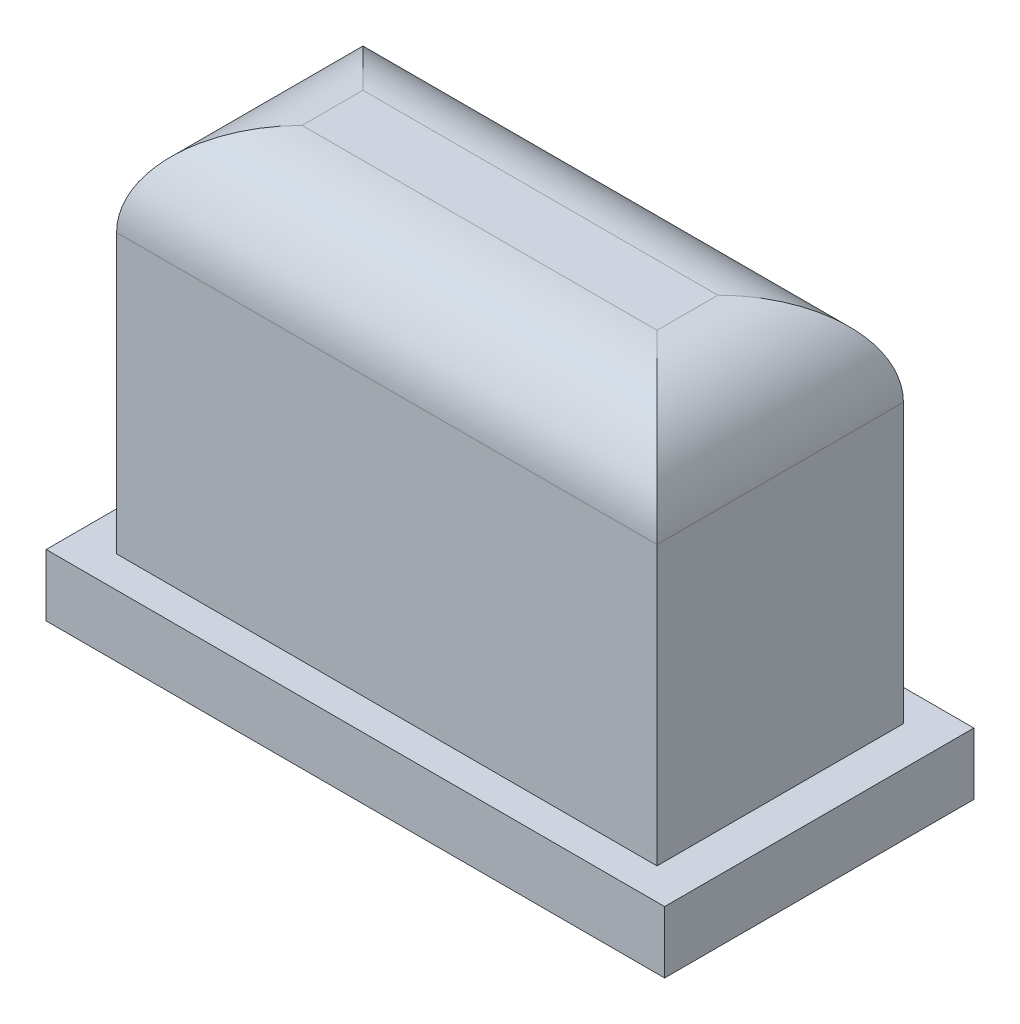
ISO-10303-21;
HEADER;
FILE_DESCRIPTION(('STEP AP214'),'2;1');
FILE_NAME('part.step','',(''),(''),'','','');
FILE_SCHEMA(('AUTOMOTIVE_DESIGN { 1 0 10303 214 1 1 1 1 }'));
ENDSEC;
DATA;
#1=APPLICATION_CONTEXT('core data for automotive mechanical design processes');
#2=APPLICATION_PROTOCOL_DEFINITION('international standard','automotive_design',2000,#1);
#3=PRODUCT_CONTEXT('',#1,'mechanical');
#4=PRODUCT('Part','Part','',(#3));
#5=PRODUCT_RELATED_PRODUCT_CATEGORY('part','',(#4));
#6=PRODUCT_DEFINITION_FORMATION('','',#4);
#7=PRODUCT_DEFINITION_CONTEXT('part definition',#1,'design');
#8=PRODUCT_DEFINITION('design','',#6,#7);
#9=PRODUCT_DEFINITION_SHAPE('','',#8);
#10=(LENGTH_UNIT() NAMED_UNIT(*) SI_UNIT(.MILLI.,.METRE.));
#11=(NAMED_UNIT(*) PLANE_ANGLE_UNIT() SI_UNIT($,.RADIAN.));
#12=(NAMED_UNIT(*) SI_UNIT($,.STERADIAN.) SOLID_ANGLE_UNIT());
#13=UNCERTAINTY_MEASURE_WITH_UNIT(LENGTH_MEASURE(1.E-05),#10,'distance_accuracy_value','');
#14=(GEOMETRIC_REPRESENTATION_CONTEXT(3) GLOBAL_UNCERTAINTY_ASSIGNED_CONTEXT((#13)) GLOBAL_UNIT_ASSIGNED_CONTEXT((#10,
#11,#12)) REPRESENTATION_CONTEXT('',''));
#15=CARTESIAN_POINT('',(0.,0.,0.));
#16=DIRECTION('',(0.,0.,1.));
#17=DIRECTION('',(1.,0.,0.));
#18=AXIS2_PLACEMENT_3D('',#15,#16,#17);
#19=CARTESIAN_POINT('',(0.,10.,0.));
#20=DIRECTION('',(0.,-1.,0.));
#21=DIRECTION('',(0.,0.,-1.));
#22=AXIS2_PLACEMENT_3D('',#19,#20,#21);
#23=PLANE('',#22);
#24=DIRECTION('',(0.,0.,-1.));
#25=VECTOR('',#24,1.);
#26=CARTESIAN_POINT('',(50.,10.,25.));
#27=LINE('',#26,#25);
#28=CARTESIAN_POINT('',(50.,10.,25.));
#29=VERTEX_POINT('',#28);
#30=CARTESIAN_POINT('',(50.,10.,-25.));
#31=VERTEX_POINT('',#30);
#32=EDGE_CURVE('E146',#29,#31,#27,.T.);
#33=ORIENTED_EDGE('',*,*,#32,.T.);
#34=DIRECTION('',(-1.,0.,0.));
#35=VECTOR('',#34,1.);
#36=CARTESIAN_POINT('',(-50.,10.,-25.));
#37=LINE('',#36,#35);
#38=CARTESIAN_POINT('',(-50.,10.,-25.));
#39=VERTEX_POINT('',#38);
#40=EDGE_CURVE('E149',#31,#39,#37,.T.);
#41=ORIENTED_EDGE('',*,*,#40,.T.);
#42=DIRECTION('',(0.,0.,1.));
#43=VECTOR('',#42,1.);
#44=CARTESIAN_POINT('',(-50.,10.,25.));
#45=LINE('',#44,#43);
#46=CARTESIAN_POINT('',(-50.,10.,25.));
#47=VERTEX_POINT('',#46);
#48=EDGE_CURVE('E152',#39,#47,#45,.T.);
#49=ORIENTED_EDGE('',*,*,#48,.T.);
#50=DIRECTION('',(1.,0.,0.));
#51=VECTOR('',#50,1.);
#52=CARTESIAN_POINT('',(-50.,10.,25.));
#53=LINE('',#52,#51);
#54=EDGE_CURVE('E154',#47,#29,#53,.T.);
#55=ORIENTED_EDGE('',*,*,#54,.T.);
#56=EDGE_LOOP('',(#33,#41,#49,#55));
#57=FACE_BOUND('',#56,.T.);
#58=DIRECTION('',(0.,0.,1.));
#59=VECTOR('',#58,1.);
#60=CARTESIAN_POINT('',(-43.6901872313672,10.,19.9187908015427));
#61=LINE('',#60,#59);
#62=CARTESIAN_POINT('',(-43.6901872313672,10.,-19.9187908015427));
#63=VERTEX_POINT('',#62);
#64=CARTESIAN_POINT('',(-43.6901872313672,10.,19.9187908015427));
#65=VERTEX_POINT('',#64);
#66=EDGE_CURVE('E119',#63,#65,#61,.T.);
#67=ORIENTED_EDGE('',*,*,#66,.F.);
#68=DIRECTION('',(-1.,0.,0.));
#69=VECTOR('',#68,1.);
#70=CARTESIAN_POINT('',(43.6901872313672,10.,-19.9187908015427));
#71=LINE('',#70,#69);
#72=CARTESIAN_POINT('',(43.6901872313672,10.,-19.9187908015427));
#73=VERTEX_POINT('',#72);
#74=EDGE_CURVE('E124',#73,#63,#71,.T.);
#75=ORIENTED_EDGE('',*,*,#74,.F.);
#76=DIRECTION('',(0.,0.,-1.));
#77=VECTOR('',#76,1.);
#78=CARTESIAN_POINT('',(43.6901872313672,10.,19.9187908015427));
#79=LINE('',#78,#77);
#80=CARTESIAN_POINT('',(43.6901872313672,10.,19.9187908015427));
#81=VERTEX_POINT('',#80);
#82=EDGE_CURVE('E135',#81,#73,#79,.T.);
#83=ORIENTED_EDGE('',*,*,#82,.F.);
#84=DIRECTION('',(1.,0.,0.));
#85=VECTOR('',#84,1.);
#86=CARTESIAN_POINT('',(43.6901872313672,10.,19.9187908015427));
#87=LINE('',#86,#85);
#88=EDGE_CURVE('E132',#65,#81,#87,.T.);
#89=ORIENTED_EDGE('',*,*,#88,.F.);
#90=EDGE_LOOP('',(#67,#75,#83,#89));
#91=FACE_BOUND('',#90,.T.);
#92=ADVANCED_FACE('F37',(#57,#91),#23,.F.);
#93=CARTESIAN_POINT('',(50.,10.,25.));
#94=DIRECTION('',(-1.,0.,0.));
#95=DIRECTION('',(0.,0.,1.));
#96=AXIS2_PLACEMENT_3D('',#93,#94,#95);
#97=PLANE('',#96);
#98=DIRECTION('',(0.,0.,-1.));
#99=VECTOR('',#98,1.);
#100=CARTESIAN_POINT('',(50.,0.,25.));
#101=LINE('',#100,#99);
#102=CARTESIAN_POINT('',(50.,0.,25.));
#103=VERTEX_POINT('',#102);
#104=CARTESIAN_POINT('',(50.,0.,-25.));
#105=VERTEX_POINT('',#104);
#106=EDGE_CURVE('E145',#103,#105,#101,.T.);
#107=ORIENTED_EDGE('',*,*,#106,.T.);
#108=DIRECTION('',(0.,-1.,0.));
#109=VECTOR('',#108,1.);
#110=CARTESIAN_POINT('',(50.,10.,-25.));
#111=LINE('',#110,#109);
#112=EDGE_CURVE('E172',#31,#105,#111,.T.);
#113=ORIENTED_EDGE('',*,*,#112,.F.);
#114=ORIENTED_EDGE('',*,*,#32,.F.);
#115=DIRECTION('',(0.,-1.,0.));
#116=VECTOR('',#115,1.);
#117=CARTESIAN_POINT('',(50.,10.,25.));
#118=LINE('',#117,#116);
#119=EDGE_CURVE('E156',#29,#103,#118,.T.);
#120=ORIENTED_EDGE('',*,*,#119,.T.);
#121=EDGE_LOOP('',(#107,#113,#114,#120));
#122=FACE_BOUND('',#121,.T.);
#123=ADVANCED_FACE('F224',(#122),#97,.F.);
#124=CARTESIAN_POINT('',(-50.,10.,-25.));
#125=DIRECTION('',(0.,0.,1.));
#126=DIRECTION('',(1.,0.,0.));
#127=AXIS2_PLACEMENT_3D('',#124,#125,#126);
#128=PLANE('',#127);
#129=DIRECTION('',(-1.,0.,0.));
#130=VECTOR('',#129,1.);
#131=CARTESIAN_POINT('',(-50.,0.,-25.));
#132=LINE('',#131,#130);
#133=CARTESIAN_POINT('',(-50.,0.,-25.));
#134=VERTEX_POINT('',#133);
#135=EDGE_CURVE('E159',#105,#134,#132,.T.);
#136=ORIENTED_EDGE('',*,*,#135,.T.);
#137=DIRECTION('',(0.,-1.,0.));
#138=VECTOR('',#137,1.);
#139=CARTESIAN_POINT('',(-50.,10.,-25.));
#140=LINE('',#139,#138);
#141=EDGE_CURVE('E169',#39,#134,#140,.T.);
#142=ORIENTED_EDGE('',*,*,#141,.F.);
#143=ORIENTED_EDGE('',*,*,#40,.F.);
#144=ORIENTED_EDGE('',*,*,#112,.T.);
#145=EDGE_LOOP('',(#136,#142,#143,#144));
#146=FACE_BOUND('',#145,.T.);
#147=ADVANCED_FACE('F230',(#146),#128,.F.);
#148=CARTESIAN_POINT('',(-50.,10.,25.));
#149=DIRECTION('',(1.,0.,0.));
#150=DIRECTION('',(0.,0.,-1.));
#151=AXIS2_PLACEMENT_3D('',#148,#149,#150);
#152=PLANE('',#151);
#153=DIRECTION('',(0.,0.,1.));
#154=VECTOR('',#153,1.);
#155=CARTESIAN_POINT('',(-50.,0.,25.));
#156=LINE('',#155,#154);
#157=CARTESIAN_POINT('',(-50.,0.,25.));
#158=VERTEX_POINT('',#157);
#159=EDGE_CURVE('E161',#134,#158,#156,.T.);
#160=ORIENTED_EDGE('',*,*,#159,.T.);
#161=DIRECTION('',(0.,-1.,0.));
#162=VECTOR('',#161,1.);
#163=CARTESIAN_POINT('',(-50.,10.,25.));
#164=LINE('',#163,#162);
#165=EDGE_CURVE('E166',#47,#158,#164,.T.);
#166=ORIENTED_EDGE('',*,*,#165,.F.);
#167=ORIENTED_EDGE('',*,*,#48,.F.);
#168=ORIENTED_EDGE('',*,*,#141,.T.);
#169=EDGE_LOOP('',(#160,#166,#167,#168));
#170=FACE_BOUND('',#169,.T.);
#171=ADVANCED_FACE('F243',(#170),#152,.F.);
#172=CARTESIAN_POINT('',(-50.,10.,25.));
#173=DIRECTION('',(0.,0.,-1.));
#174=DIRECTION('',(-1.,0.,0.));
#175=AXIS2_PLACEMENT_3D('',#172,#173,#174);
#176=PLANE('',#175);
#177=DIRECTION('',(1.,0.,0.));
#178=VECTOR('',#177,1.);
#179=CARTESIAN_POINT('',(-50.,0.,25.));
#180=LINE('',#179,#178);
#181=EDGE_CURVE('E150',#158,#103,#180,.T.);
#182=ORIENTED_EDGE('',*,*,#181,.T.);
#183=ORIENTED_EDGE('',*,*,#119,.F.);
#184=ORIENTED_EDGE('',*,*,#54,.F.);
#185=ORIENTED_EDGE('',*,*,#165,.T.);
#186=EDGE_LOOP('',(#182,#183,#184,#185));
#187=FACE_BOUND('',#186,.T.);
#188=ADVANCED_FACE('F239',(#187),#176,.F.);
#189=CARTESIAN_POINT('',(0.,0.,0.));
#190=DIRECTION('',(0.,-1.,0.));
#191=DIRECTION('',(0.,0.,-1.));
#192=AXIS2_PLACEMENT_3D('',#189,#190,#191);
#193=PLANE('',#192);
#194=CARTESIAN_POINT('',(0.,0.,0.));
#195=DIRECTION('',(0.,-1.,0.));
#196=DIRECTION('',(0.,0.,-1.));
#197=AXIS2_PLACEMENT_3D('',#194,#195,#196);
#198=CIRCLE('',#197,6.08239751934734);
#199=CARTESIAN_POINT('',(0.,0.,-6.08239751934734));
#200=VERTEX_POINT('',#199);
#201=EDGE_CURVE('E382',#200,#200,#198,.T.);
#202=ORIENTED_EDGE('',*,*,#201,.F.);
#203=EDGE_LOOP('',(#202));
#204=FACE_BOUND('',#203,.T.);
#205=ORIENTED_EDGE('',*,*,#106,.F.);
#206=ORIENTED_EDGE('',*,*,#181,.F.);
#207=ORIENTED_EDGE('',*,*,#159,.F.);
#208=ORIENTED_EDGE('',*,*,#135,.F.);
#209=EDGE_LOOP('',(#205,#206,#207,#208));
#210=FACE_BOUND('',#209,.T.);
#211=ADVANCED_FACE('F236',(#204,#210),#193,.T.);
#212=CARTESIAN_POINT('',(-43.6901872313672,70.,19.9187908015427));
#213=DIRECTION('',(1.,0.,0.));
#214=DIRECTION('',(0.,0.,-1.));
#215=AXIS2_PLACEMENT_3D('',#212,#213,#214);
#216=PLANE('',#215);
#217=DIRECTION('',(0.,-1.,0.));
#218=VECTOR('',#217,1.);
#219=CARTESIAN_POINT('',(-43.6901872313672,70.,19.9187908015427));
#220=LINE('',#219,#218);
#221=CARTESIAN_POINT('',(-43.6901872313672,55.,19.9187908015427));
#222=VERTEX_POINT('',#221);
#223=EDGE_CURVE('E143',#222,#65,#220,.T.);
#224=ORIENTED_EDGE('',*,*,#223,.F.);
#225=DIRECTION('',(0.,0.,1.));
#226=VECTOR('',#225,1.);
#227=CARTESIAN_POINT('',(-43.6901872313672,55.,-19.9187908015427));
#228=LINE('',#227,#226);
#229=CARTESIAN_POINT('',(-43.6901872313672,55.,-19.9187908015427));
#230=VERTEX_POINT('',#229);
#231=EDGE_CURVE('E121',#222,#230,#228,.F.);
#232=ORIENTED_EDGE('',*,*,#231,.T.);
#233=DIRECTION('',(0.,-1.,0.));
#234=VECTOR('',#233,1.);
#235=CARTESIAN_POINT('',(-43.6901872313672,70.,-19.9187908015427));
#236=LINE('',#235,#234);
#237=EDGE_CURVE('E115',#230,#63,#236,.T.);
#238=ORIENTED_EDGE('',*,*,#237,.T.);
#239=ORIENTED_EDGE('',*,*,#66,.T.);
#240=EDGE_LOOP('',(#224,#232,#238,#239));
#241=FACE_BOUND('',#240,.T.);
#242=ADVANCED_FACE('F118',(#241),#216,.F.);
#243=CARTESIAN_POINT('',(43.6901872313672,70.,19.9187908015427));
#244=DIRECTION('',(0.,0.,-1.));
#245=DIRECTION('',(-1.,0.,0.));
#246=AXIS2_PLACEMENT_3D('',#243,#244,#245);
#247=PLANE('',#246);
#248=DIRECTION('',(0.,-1.,0.));
#249=VECTOR('',#248,1.);
#250=CARTESIAN_POINT('',(43.6901872313672,70.,19.9187908015427));
#251=LINE('',#250,#249);
#252=CARTESIAN_POINT('',(43.6901872313672,55.,19.9187908015427));
#253=VERTEX_POINT('',#252);
#254=EDGE_CURVE('E141',#253,#81,#251,.T.);
#255=ORIENTED_EDGE('',*,*,#254,.F.);
#256=DIRECTION('',(1.,0.,0.));
#257=VECTOR('',#256,1.);
#258=CARTESIAN_POINT('',(-43.6901872313672,55.,19.9187908015427));
#259=LINE('',#258,#257);
#260=EDGE_CURVE('E11',#253,#222,#259,.F.);
#261=ORIENTED_EDGE('',*,*,#260,.T.);
#262=ORIENTED_EDGE('',*,*,#223,.T.);
#263=ORIENTED_EDGE('',*,*,#88,.T.);
#264=EDGE_LOOP('',(#255,#261,#262,#263));
#265=FACE_BOUND('',#264,.T.);
#266=ADVANCED_FACE('F208',(#265),#247,.F.);
#267=CARTESIAN_POINT('',(43.6901872313672,70.,19.9187908015427));
#268=DIRECTION('',(-1.,0.,0.));
#269=DIRECTION('',(0.,0.,1.));
#270=AXIS2_PLACEMENT_3D('',#267,#268,#269);
#271=PLANE('',#270);
#272=DIRECTION('',(0.,-1.,0.));
#273=VECTOR('',#272,1.);
#274=CARTESIAN_POINT('',(43.6901872313672,70.,-19.9187908015427));
#275=LINE('',#274,#273);
#276=CARTESIAN_POINT('',(43.6901872313672,55.,-19.9187908015427));
#277=VERTEX_POINT('',#276);
#278=EDGE_CURVE('E123',#277,#73,#275,.T.);
#279=ORIENTED_EDGE('',*,*,#278,.F.);
#280=DIRECTION('',(0.,0.,-1.));
#281=VECTOR('',#280,1.);
#282=CARTESIAN_POINT('',(43.6901872313672,55.,19.9187908015427));
#283=LINE('',#282,#281);
#284=EDGE_CURVE('E46',#277,#253,#283,.F.);
#285=ORIENTED_EDGE('',*,*,#284,.T.);
#286=ORIENTED_EDGE('',*,*,#254,.T.);
#287=ORIENTED_EDGE('',*,*,#82,.T.);
#288=EDGE_LOOP('',(#279,#285,#286,#287));
#289=FACE_BOUND('',#288,.T.);
#290=ADVANCED_FACE('F220',(#289),#271,.F.);
#291=CARTESIAN_POINT('',(43.6901872313672,70.,-19.9187908015427));
#292=DIRECTION('',(0.,0.,1.));
#293=DIRECTION('',(1.,0.,0.));
#294=AXIS2_PLACEMENT_3D('',#291,#292,#293);
#295=PLANE('',#294);
#296=ORIENTED_EDGE('',*,*,#237,.F.);
#297=DIRECTION('',(-1.,0.,0.));
#298=VECTOR('',#297,1.);
#299=CARTESIAN_POINT('',(43.6901872313672,55.,-19.9187908015427));
#300=LINE('',#299,#298);
#301=EDGE_CURVE('E61',#230,#277,#300,.F.);
#302=ORIENTED_EDGE('',*,*,#301,.T.);
#303=ORIENTED_EDGE('',*,*,#278,.T.);
#304=ORIENTED_EDGE('',*,*,#74,.T.);
#305=EDGE_LOOP('',(#296,#302,#303,#304));
#306=FACE_BOUND('',#305,.T.);
#307=ADVANCED_FACE('F134',(#306),#295,.F.);
#308=CARTESIAN_POINT('',(0.,70.,0.));
#309=DIRECTION('',(0.,1.,0.));
#310=DIRECTION('',(0.,0.,1.));
#311=AXIS2_PLACEMENT_3D('',#308,#309,#310);
#312=PLANE('',#311);
#313=DIRECTION('',(-1.,0.,0.));
#314=VECTOR('',#313,1.);
#315=CARTESIAN_POINT('',(-43.6901872313672,70.,-4.9187908015427));
#316=LINE('',#315,#314);
#317=CARTESIAN_POINT('',(28.6901872313673,70.,-4.9187908015427));
#318=VERTEX_POINT('',#317);
#319=CARTESIAN_POINT('',(-28.6901872313673,70.,-4.9187908015427));
#320=VERTEX_POINT('',#319);
#321=EDGE_CURVE('E179',#318,#320,#316,.T.);
#322=ORIENTED_EDGE('',*,*,#321,.T.);
#323=DIRECTION('',(0.,0.,1.));
#324=VECTOR('',#323,1.);
#325=CARTESIAN_POINT('',(-28.6901872313673,70.,19.9187908015427));
#326=LINE('',#325,#324);
#327=CARTESIAN_POINT('',(-28.6901872313673,70.,4.9187908015427));
#328=VERTEX_POINT('',#327);
#329=EDGE_CURVE('E181',#320,#328,#326,.T.);
#330=ORIENTED_EDGE('',*,*,#329,.T.);
#331=DIRECTION('',(1.,0.,0.));
#332=VECTOR('',#331,1.);
#333=CARTESIAN_POINT('',(43.6901872313672,70.,4.9187908015427));
#334=LINE('',#333,#332);
#335=CARTESIAN_POINT('',(28.6901872313673,70.,4.9187908015427));
#336=VERTEX_POINT('',#335);
#337=EDGE_CURVE('E175',#328,#336,#334,.T.);
#338=ORIENTED_EDGE('',*,*,#337,.T.);
#339=DIRECTION('',(0.,0.,-1.));
#340=VECTOR('',#339,1.);
#341=CARTESIAN_POINT('',(28.6901872313673,70.,-19.9187908015427));
#342=LINE('',#341,#340);
#343=EDGE_CURVE('E177',#336,#318,#342,.T.);
#344=ORIENTED_EDGE('',*,*,#343,.T.);
#345=EDGE_LOOP('',(#322,#330,#338,#344));
#346=FACE_BOUND('',#345,.T.);
#347=ADVANCED_FACE('F213',(#346),#312,.T.);
#348=CARTESIAN_POINT('',(28.6901872313673,55.,0.));
#349=DIRECTION('',(0.,0.,1.));
#350=DIRECTION('',(1.,0.,0.));
#351=AXIS2_PLACEMENT_3D('',#348,#349,#350);
#352=CYLINDRICAL_SURFACE('',#351,15.);
#353=CARTESIAN_POINT('',(28.6901872313673,55.,4.9187908015427));
#354=DIRECTION('',(-0.707106781186547,0.,0.707106781186547));
#355=DIRECTION('',(-0.707106781186547,0.,-0.707106781186547));
#356=AXIS2_PLACEMENT_3D('',#353,#354,#355);
#357=ELLIPSE('',#356,21.2132034355964,15.);
#358=EDGE_CURVE('E191',#253,#336,#357,.T.);
#359=ORIENTED_EDGE('',*,*,#358,.F.);
#360=ORIENTED_EDGE('',*,*,#284,.F.);
#361=CARTESIAN_POINT('',(28.6901872313673,55.,-4.9187908015427));
#362=DIRECTION('',(0.707106781186547,0.,0.707106781186547));
#363=DIRECTION('',(-0.707106781186547,0.,0.707106781186547));
#364=AXIS2_PLACEMENT_3D('',#361,#362,#363);
#365=ELLIPSE('',#364,21.2132034355964,15.);
#366=EDGE_CURVE('E41',#318,#277,#365,.F.);
#367=ORIENTED_EDGE('',*,*,#366,.F.);
#368=ORIENTED_EDGE('',*,*,#343,.F.);
#369=EDGE_LOOP('',(#359,#360,#367,#368));
#370=FACE_BOUND('',#369,.T.);
#371=ADVANCED_FACE('F39',(#370),#352,.T.);
#372=CARTESIAN_POINT('',(0.,55.,-4.9187908015427));
#373=DIRECTION('',(1.,0.,0.));
#374=DIRECTION('',(0.,0.,-1.));
#375=AXIS2_PLACEMENT_3D('',#372,#373,#374);
#376=CYLINDRICAL_SURFACE('',#375,15.);
#377=ORIENTED_EDGE('',*,*,#366,.T.);
#378=ORIENTED_EDGE('',*,*,#301,.F.);
#379=CARTESIAN_POINT('',(-28.6901872313673,55.,-4.9187908015427));
#380=DIRECTION('',(0.707106781186547,0.,-0.707106781186547));
#381=DIRECTION('',(0.707106781186547,0.,0.707106781186547));
#382=AXIS2_PLACEMENT_3D('',#379,#380,#381);
#383=ELLIPSE('',#382,21.2132034355964,15.);
#384=EDGE_CURVE('E189',#320,#230,#383,.F.);
#385=ORIENTED_EDGE('',*,*,#384,.F.);
#386=ORIENTED_EDGE('',*,*,#321,.F.);
#387=EDGE_LOOP('',(#377,#378,#385,#386));
#388=FACE_BOUND('',#387,.T.);
#389=ADVANCED_FACE('F201',(#388),#376,.T.);
#390=CARTESIAN_POINT('',(0.,55.,4.9187908015427));
#391=DIRECTION('',(-1.,0.,0.));
#392=DIRECTION('',(0.,0.,1.));
#393=AXIS2_PLACEMENT_3D('',#390,#391,#392);
#394=CYLINDRICAL_SURFACE('',#393,15.);
#395=ORIENTED_EDGE('',*,*,#358,.T.);
#396=ORIENTED_EDGE('',*,*,#337,.F.);
#397=CARTESIAN_POINT('',(-28.6901872313673,55.,4.9187908015427));
#398=DIRECTION('',(-0.707106781186547,0.,-0.707106781186547));
#399=DIRECTION('',(-0.707106781186547,0.,0.707106781186547));
#400=AXIS2_PLACEMENT_3D('',#397,#398,#399);
#401=ELLIPSE('',#400,21.2132034355964,15.);
#402=EDGE_CURVE('E187',#222,#328,#401,.T.);
#403=ORIENTED_EDGE('',*,*,#402,.F.);
#404=ORIENTED_EDGE('',*,*,#260,.F.);
#405=EDGE_LOOP('',(#395,#396,#403,#404));
#406=FACE_BOUND('',#405,.T.);
#407=ADVANCED_FACE('F206',(#406),#394,.T.);
#408=CARTESIAN_POINT('',(-28.6901872313673,55.,0.));
#409=DIRECTION('',(0.,0.,-1.));
#410=DIRECTION('',(-1.,0.,0.));
#411=AXIS2_PLACEMENT_3D('',#408,#409,#410);
#412=CYLINDRICAL_SURFACE('',#411,15.);
#413=ORIENTED_EDGE('',*,*,#384,.T.);
#414=ORIENTED_EDGE('',*,*,#231,.F.);
#415=ORIENTED_EDGE('',*,*,#402,.T.);
#416=ORIENTED_EDGE('',*,*,#329,.F.);
#417=EDGE_LOOP('',(#413,#414,#415,#416));
#418=FACE_BOUND('',#417,.T.);
#419=ADVANCED_FACE('F210',(#418),#412,.T.);
#420=CARTESIAN_POINT('',(0.,-10.,0.));
#421=DIRECTION('',(0.,1.,0.));
#422=DIRECTION('',(0.,0.,1.));
#423=AXIS2_PLACEMENT_3D('',#420,#421,#422);
#424=CYLINDRICAL_SURFACE('',#423,6.08239751934734);
#425=CARTESIAN_POINT('',(0.,-10.,0.));
#426=DIRECTION('',(0.,-1.,0.));
#427=DIRECTION('',(0.,0.,-1.));
#428=AXIS2_PLACEMENT_3D('',#425,#426,#427);
#429=CIRCLE('',#428,6.08239751934734);
#430=CARTESIAN_POINT('',(0.,-10.,-6.08239751934734));
#431=VERTEX_POINT('',#430);
#432=EDGE_CURVE('E190',#431,#431,#429,.T.);
#433=ORIENTED_EDGE('',*,*,#432,.F.);
#434=EDGE_LOOP('',(#433));
#435=FACE_BOUND('',#434,.T.);
#436=ORIENTED_EDGE('',*,*,#201,.T.);
#437=EDGE_LOOP('',(#436));
#438=FACE_BOUND('',#437,.T.);
#439=ADVANCED_FACE('F253',(#435,#438),#424,.T.);
#440=CARTESIAN_POINT('',(0.,-10.,0.));
#441=DIRECTION('',(0.,-1.,0.));
#442=DIRECTION('',(0.,0.,-1.));
#443=AXIS2_PLACEMENT_3D('',#440,#441,#442);
#444=PLANE('',#443);
#445=ORIENTED_EDGE('',*,*,#432,.T.);
#446=EDGE_LOOP('',(#445));
#447=FACE_BOUND('',#446,.T.);
#448=ADVANCED_FACE('F274',(#447),#444,.T.);
#449=CLOSED_SHELL('',(#92,#123,#147,#171,#188,#211,#242,#266,#290,#307,#347,#371,#389,#407,#419,
#439,#448));
#450=MANIFOLD_SOLID_BREP('B2',#449);
#451=ADVANCED_BREP_SHAPE_REPRESENTATION('',(#18,#450),#14);
#452=SHAPE_DEFINITION_REPRESENTATION(#9,#451);
ENDSEC;
END-ISO-10303-21;
